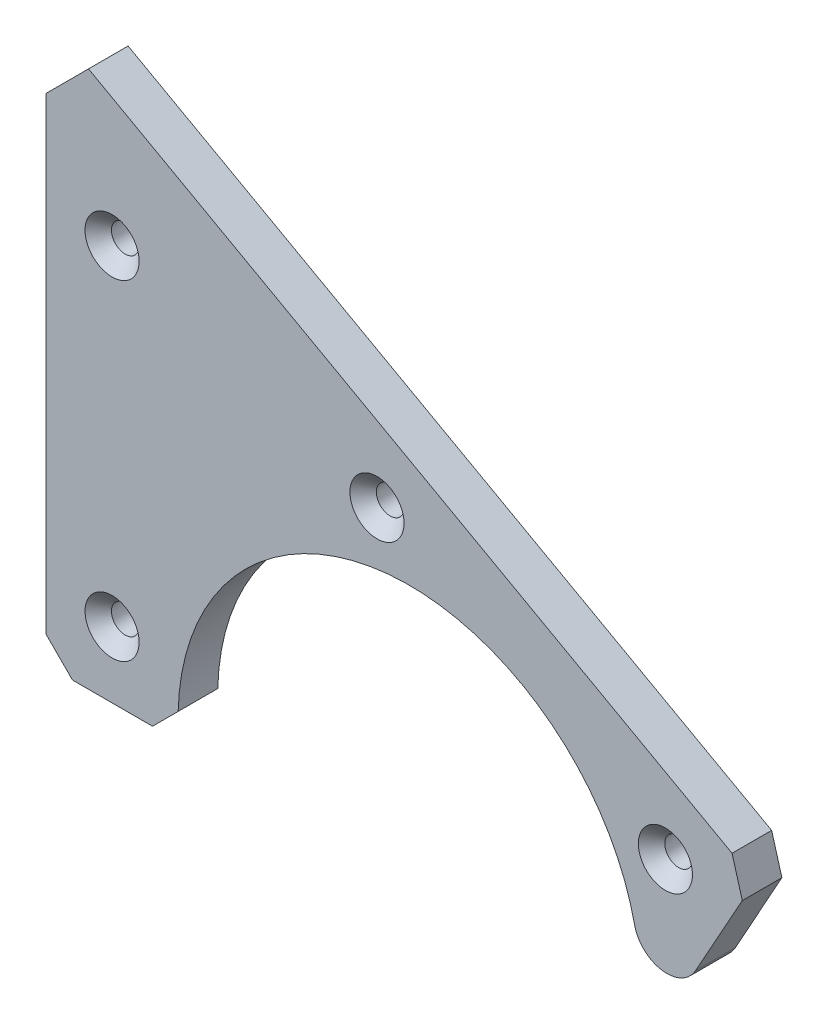
ISO-10303-21;
HEADER;
FILE_DESCRIPTION(('STEP AP214'),'2;1');
FILE_NAME('part.step','',(''),(''),'','','');
FILE_SCHEMA(('AUTOMOTIVE_DESIGN { 1 0 10303 214 1 1 1 1 }'));
ENDSEC;
DATA;
#1=APPLICATION_CONTEXT('core data for automotive mechanical design processes');
#2=APPLICATION_PROTOCOL_DEFINITION('international standard','automotive_design',2000,#1);
#3=PRODUCT_CONTEXT('',#1,'mechanical');
#4=PRODUCT('Part','Part','',(#3));
#5=PRODUCT_RELATED_PRODUCT_CATEGORY('part','',(#4));
#6=PRODUCT_DEFINITION_FORMATION('','',#4);
#7=PRODUCT_DEFINITION_CONTEXT('part definition',#1,'design');
#8=PRODUCT_DEFINITION('design','',#6,#7);
#9=PRODUCT_DEFINITION_SHAPE('','',#8);
#10=(LENGTH_UNIT() NAMED_UNIT(*) SI_UNIT(.MILLI.,.METRE.));
#11=(NAMED_UNIT(*) PLANE_ANGLE_UNIT() SI_UNIT($,.RADIAN.));
#12=(NAMED_UNIT(*) SI_UNIT($,.STERADIAN.) SOLID_ANGLE_UNIT());
#13=UNCERTAINTY_MEASURE_WITH_UNIT(LENGTH_MEASURE(1.E-05),#10,'distance_accuracy_value','');
#14=(GEOMETRIC_REPRESENTATION_CONTEXT(3) GLOBAL_UNCERTAINTY_ASSIGNED_CONTEXT((#13)) GLOBAL_UNIT_ASSIGNED_CONTEXT((#10,
#11,#12)) REPRESENTATION_CONTEXT('',''));
#15=CARTESIAN_POINT('',(0.,0.,0.));
#16=DIRECTION('',(0.,0.,1.));
#17=DIRECTION('',(1.,0.,0.));
#18=AXIS2_PLACEMENT_3D('',#15,#16,#17);
#19=CARTESIAN_POINT('',(0.,0.,3.));
#20=DIRECTION('',(0.,0.,1.));
#21=DIRECTION('',(1.,0.,0.));
#22=AXIS2_PLACEMENT_3D('',#19,#20,#21);
#23=PLANE('',#22);
#24=DIRECTION('',(1.,0.,0.));
#25=VECTOR('',#24,1.);
#26=CARTESIAN_POINT('',(-55.,-2.96629373950943,3.));
#27=LINE('',#26,#25);
#28=CARTESIAN_POINT('',(-51.,-2.96629373950943,3.));
#29=VERTEX_POINT('',#28);
#30=CARTESIAN_POINT('',(-38.8740749189272,-2.96629373950943,3.));
#31=VERTEX_POINT('',#30);
#32=EDGE_CURVE('E235',#29,#31,#27,.T.);
#33=ORIENTED_EDGE('',*,*,#32,.T.);
#34=DIRECTION('',(0.707106781186549,0.707106781186546,0.));
#35=VECTOR('',#34,1.);
#36=CARTESIAN_POINT('',(-17.9538905897088,17.9538905897089,3.));
#37=LINE('',#36,#35);
#38=CARTESIAN_POINT('',(-34.9879098656391,0.919871313778582,3.));
#39=VERTEX_POINT('',#38);
#40=EDGE_CURVE('E11',#31,#39,#37,.T.);
#41=ORIENTED_EDGE('',*,*,#40,.T.);
#42=CARTESIAN_POINT('',(0.,0.,3.));
#43=DIRECTION('',(0.,0.,1.));
#44=DIRECTION('',(1.,0.,0.));
#45=AXIS2_PLACEMENT_3D('',#42,#43,#44);
#46=CIRCLE('',#45,35.);
#47=CARTESIAN_POINT('',(34.1894196895976,7.48889720109401,3.));
#48=VERTEX_POINT('',#47);
#49=EDGE_CURVE('E219',#48,#39,#46,.T.);
#50=ORIENTED_EDGE('',*,*,#49,.F.);
#51=CARTESIAN_POINT('',(39.0736225023973,8.55873965839316,3.));
#52=DIRECTION('',(0.,0.,1.));
#53=DIRECTION('',(1.,0.,0.));
#54=AXIS2_PLACEMENT_3D('',#51,#52,#53);
#55=CIRCLE('',#54,5.);
#56=CARTESIAN_POINT('',(43.444408883005,6.13052500250001,3.));
#57=VERTEX_POINT('',#56);
#58=EDGE_CURVE('E206',#48,#57,#55,.T.);
#59=ORIENTED_EDGE('',*,*,#58,.T.);
#60=DIRECTION('',(0.485642931178632,0.874157276121538,0.));
#61=VECTOR('',#60,1.);
#62=CARTESIAN_POINT('',(30.5955046642538,-16.9975025912521,3.));
#63=LINE('',#62,#61);
#64=CARTESIAN_POINT('',(50.5068648425777,18.842945729731,3.));
#65=VERTEX_POINT('',#64);
#66=EDGE_CURVE('E135',#57,#65,#63,.T.);
#67=ORIENTED_EDGE('',*,*,#66,.T.);
#68=DIRECTION('',(0.27472112789738,-0.961523947640823,0.));
#69=VECTOR('',#68,1.);
#70=CARTESIAN_POINT('',(51.6724078774065,14.7635451078305,3.));
#71=LINE('',#70,#69);
#72=CARTESIAN_POINT('',(48.9528074628061,24.2821465589316,3.));
#73=VERTEX_POINT('',#72);
#74=EDGE_CURVE('E159',#65,#73,#71,.F.);
#75=ORIENTED_EDGE('',*,*,#74,.T.);
#76=DIRECTION('',(-0.874157276121538,0.485642931178632,0.));
#77=VECTOR('',#76,1.);
#78=CARTESIAN_POINT('',(52.4494365672923,22.3395748342171,3.));
#79=LINE('',#78,#77);
#80=CARTESIAN_POINT('',(-48.5714285714286,78.462277689062,3.));
#81=VERTEX_POINT('',#80);
#82=EDGE_CURVE('E134',#73,#81,#79,.T.);
#83=ORIENTED_EDGE('',*,*,#82,.T.);
#84=DIRECTION('',(0.707106781186546,0.707106781186549,0.));
#85=VECTOR('',#84,1.);
#86=CARTESIAN_POINT('',(-63.5168531302454,63.5168531302451,3.));
#87=LINE('',#86,#85);
#88=CARTESIAN_POINT('',(-55.,72.0337062604905,3.));
#89=VERTEX_POINT('',#88);
#90=EDGE_CURVE('E173',#81,#89,#87,.F.);
#91=ORIENTED_EDGE('',*,*,#90,.T.);
#92=DIRECTION('',(0.,-1.,0.));
#93=VECTOR('',#92,1.);
#94=CARTESIAN_POINT('',(-55.,82.0337062604906,3.));
#95=LINE('',#94,#93);
#96=CARTESIAN_POINT('',(-55.,1.03370626049055,3.));
#97=VERTEX_POINT('',#96);
#98=EDGE_CURVE('E234',#89,#97,#95,.T.);
#99=ORIENTED_EDGE('',*,*,#98,.T.);
#100=DIRECTION('',(-0.707106781186546,0.707106781186549,0.));
#101=VECTOR('',#100,1.);
#102=CARTESIAN_POINT('',(-26.9831468697548,-26.9831468697547,3.));
#103=LINE('',#102,#101);
#104=EDGE_CURVE('E157',#97,#29,#103,.F.);
#105=ORIENTED_EDGE('',*,*,#104,.T.);
#106=EDGE_LOOP('',(#33,#41,#50,#59,#67,#75,#83,#91,#99,#105));
#107=FACE_BOUND('',#106,.T.);
#108=CARTESIAN_POINT('',(38.8514344942906,18.454431384788,3.));
#109=DIRECTION('',(0.,0.,1.));
#110=DIRECTION('',(1.,0.,0.));
#111=AXIS2_PLACEMENT_3D('',#108,#109,#110);
#112=CIRCLE('',#111,4.10000000000002);
#113=CARTESIAN_POINT('',(42.9514344942906,18.454431384788,3.));
#114=VERTEX_POINT('',#113);
#115=EDGE_CURVE('E184',#114,#114,#112,.F.);
#116=ORIENTED_EDGE('',*,*,#115,.T.);
#117=EDGE_LOOP('',(#116));
#118=FACE_BOUND('',#117,.T.);
#119=CARTESIAN_POINT('',(-4.85642931178634,42.7365779437196,3.));
#120=DIRECTION('',(0.,0.,1.));
#121=DIRECTION('',(1.,0.,0.));
#122=AXIS2_PLACEMENT_3D('',#119,#120,#121);
#123=CIRCLE('',#122,4.09999999999998);
#124=CARTESIAN_POINT('',(-0.756429311786358,42.7365779437196,3.));
#125=VERTEX_POINT('',#124);
#126=EDGE_CURVE('E181',#125,#125,#123,.F.);
#127=ORIENTED_EDGE('',*,*,#126,.T.);
#128=EDGE_LOOP('',(#127));
#129=FACE_BOUND('',#128,.T.);
#130=CARTESIAN_POINT('',(-45.,7.03370626049057,3.));
#131=DIRECTION('',(0.,0.,1.));
#132=DIRECTION('',(1.,0.,0.));
#133=AXIS2_PLACEMENT_3D('',#130,#131,#132);
#134=CIRCLE('',#133,4.09999999999998);
#135=CARTESIAN_POINT('',(-40.9,7.03370626049057,3.));
#136=VERTEX_POINT('',#135);
#137=EDGE_CURVE('E178',#136,#136,#134,.F.);
#138=ORIENTED_EDGE('',*,*,#137,.T.);
#139=EDGE_LOOP('',(#138));
#140=FACE_BOUND('',#139,.T.);
#141=CARTESIAN_POINT('',(-45.,57.0337062604906,3.));
#142=DIRECTION('',(0.,0.,1.));
#143=DIRECTION('',(1.,0.,0.));
#144=AXIS2_PLACEMENT_3D('',#141,#142,#143);
#145=CIRCLE('',#144,4.09999999999998);
#146=CARTESIAN_POINT('',(-40.9,57.0337062604906,3.));
#147=VERTEX_POINT('',#146);
#148=EDGE_CURVE('E175',#147,#147,#145,.F.);
#149=ORIENTED_EDGE('',*,*,#148,.T.);
#150=EDGE_LOOP('',(#149));
#151=FACE_BOUND('',#150,.T.);
#152=ADVANCED_FACE('F37',(#107,#118,#129,#140,#151),#23,.T.);
#153=CARTESIAN_POINT('',(0.,0.,-3.));
#154=DIRECTION('',(0.,0.,1.));
#155=DIRECTION('',(1.,0.,0.));
#156=AXIS2_PLACEMENT_3D('',#153,#154,#155);
#157=PLANE('',#156);
#158=CARTESIAN_POINT('',(-4.85642931178634,42.7365779437196,-3.));
#159=DIRECTION('',(0.,0.,1.));
#160=DIRECTION('',(1.,0.,0.));
#161=AXIS2_PLACEMENT_3D('',#158,#159,#160);
#162=CIRCLE('',#161,2.1);
#163=CARTESIAN_POINT('',(-2.75642931178634,42.7365779437196,-3.));
#164=VERTEX_POINT('',#163);
#165=EDGE_CURVE('E225',#164,#164,#162,.T.);
#166=ORIENTED_EDGE('',*,*,#165,.T.);
#167=EDGE_LOOP('',(#166));
#168=FACE_BOUND('',#167,.T.);
#169=CARTESIAN_POINT('',(38.8514344942906,18.454431384788,-3.));
#170=DIRECTION('',(0.,0.,1.));
#171=DIRECTION('',(1.,0.,0.));
#172=AXIS2_PLACEMENT_3D('',#169,#170,#171);
#173=CIRCLE('',#172,2.1);
#174=CARTESIAN_POINT('',(40.9514344942906,18.454431384788,-3.));
#175=VERTEX_POINT('',#174);
#176=EDGE_CURVE('E222',#175,#175,#173,.T.);
#177=ORIENTED_EDGE('',*,*,#176,.T.);
#178=EDGE_LOOP('',(#177));
#179=FACE_BOUND('',#178,.T.);
#180=CARTESIAN_POINT('',(-45.,7.03370626049057,-3.));
#181=DIRECTION('',(0.,0.,1.));
#182=DIRECTION('',(1.,0.,0.));
#183=AXIS2_PLACEMENT_3D('',#180,#181,#182);
#184=CIRCLE('',#183,2.1);
#185=CARTESIAN_POINT('',(-42.9,7.03370626049057,-3.));
#186=VERTEX_POINT('',#185);
#187=EDGE_CURVE('E141',#186,#186,#184,.T.);
#188=ORIENTED_EDGE('',*,*,#187,.T.);
#189=EDGE_LOOP('',(#188));
#190=FACE_BOUND('',#189,.T.);
#191=CARTESIAN_POINT('',(-45.,57.0337062604906,-3.));
#192=DIRECTION('',(0.,0.,1.));
#193=DIRECTION('',(1.,0.,0.));
#194=AXIS2_PLACEMENT_3D('',#191,#192,#193);
#195=CIRCLE('',#194,2.1);
#196=CARTESIAN_POINT('',(-42.9,57.0337062604906,-3.));
#197=VERTEX_POINT('',#196);
#198=EDGE_CURVE('E146',#197,#197,#195,.T.);
#199=ORIENTED_EDGE('',*,*,#198,.T.);
#200=EDGE_LOOP('',(#199));
#201=FACE_BOUND('',#200,.T.);
#202=CARTESIAN_POINT('',(0.,0.,-3.));
#203=DIRECTION('',(0.,0.,1.));
#204=DIRECTION('',(1.,0.,0.));
#205=AXIS2_PLACEMENT_3D('',#202,#203,#204);
#206=CIRCLE('',#205,35.);
#207=CARTESIAN_POINT('',(34.1894196895976,7.48889720109401,-3.));
#208=VERTEX_POINT('',#207);
#209=CARTESIAN_POINT('',(-34.9879098656391,0.919871313778582,-3.));
#210=VERTEX_POINT('',#209);
#211=EDGE_CURVE('E216',#208,#210,#206,.T.);
#212=ORIENTED_EDGE('',*,*,#211,.T.);
#213=DIRECTION('',(-0.707106781186549,-0.707106781186546,0.));
#214=VECTOR('',#213,1.);
#215=CARTESIAN_POINT('',(-34.9879098656391,0.919871313778582,-3.));
#216=LINE('',#215,#214);
#217=CARTESIAN_POINT('',(-38.8740749189272,-2.96629373950943,-3.));
#218=VERTEX_POINT('',#217);
#219=EDGE_CURVE('E60',#210,#218,#216,.T.);
#220=ORIENTED_EDGE('',*,*,#219,.T.);
#221=DIRECTION('',(1.,0.,0.));
#222=VECTOR('',#221,1.);
#223=CARTESIAN_POINT('',(-55.,-2.96629373950943,-3.));
#224=LINE('',#223,#222);
#225=CARTESIAN_POINT('',(-51.,-2.96629373950943,-3.));
#226=VERTEX_POINT('',#225);
#227=EDGE_CURVE('E143',#226,#218,#224,.T.);
#228=ORIENTED_EDGE('',*,*,#227,.F.);
#229=DIRECTION('',(0.707106781186546,-0.707106781186549,0.));
#230=VECTOR('',#229,1.);
#231=CARTESIAN_POINT('',(-51.,-2.96629373950943,-3.));
#232=LINE('',#231,#230);
#233=CARTESIAN_POINT('',(-55.,1.03370626049055,-3.));
#234=VERTEX_POINT('',#233);
#235=EDGE_CURVE('E125',#226,#234,#232,.F.);
#236=ORIENTED_EDGE('',*,*,#235,.T.);
#237=DIRECTION('',(0.,-1.,0.));
#238=VECTOR('',#237,1.);
#239=CARTESIAN_POINT('',(-55.,82.0337062604906,-3.));
#240=LINE('',#239,#238);
#241=CARTESIAN_POINT('',(-55.,72.0337062604905,-3.));
#242=VERTEX_POINT('',#241);
#243=EDGE_CURVE('E140',#242,#234,#240,.T.);
#244=ORIENTED_EDGE('',*,*,#243,.F.);
#245=DIRECTION('',(-0.707106781186546,-0.707106781186549,0.));
#246=VECTOR('',#245,1.);
#247=CARTESIAN_POINT('',(-55.,72.0337062604905,-3.));
#248=LINE('',#247,#246);
#249=CARTESIAN_POINT('',(-48.5714285714286,78.462277689062,-3.));
#250=VERTEX_POINT('',#249);
#251=EDGE_CURVE('E139',#242,#250,#248,.F.);
#252=ORIENTED_EDGE('',*,*,#251,.T.);
#253=DIRECTION('',(-0.874157276121538,0.485642931178632,0.));
#254=VECTOR('',#253,1.);
#255=CARTESIAN_POINT('',(52.4494365672923,22.3395748342171,-3.));
#256=LINE('',#255,#254);
#257=CARTESIAN_POINT('',(48.9528074628061,24.2821465589316,-3.));
#258=VERTEX_POINT('',#257);
#259=EDGE_CURVE('E131',#258,#250,#256,.T.);
#260=ORIENTED_EDGE('',*,*,#259,.F.);
#261=DIRECTION('',(-0.27472112789738,0.961523947640823,0.));
#262=VECTOR('',#261,1.);
#263=CARTESIAN_POINT('',(48.9528074628061,24.2821465589316,-3.));
#264=LINE('',#263,#262);
#265=CARTESIAN_POINT('',(50.5068648425777,18.842945729731,-3.));
#266=VERTEX_POINT('',#265);
#267=EDGE_CURVE('E116',#258,#266,#264,.F.);
#268=ORIENTED_EDGE('',*,*,#267,.T.);
#269=DIRECTION('',(0.485642931178632,0.874157276121538,0.));
#270=VECTOR('',#269,1.);
#271=CARTESIAN_POINT('',(30.5955046642538,-16.9975025912521,-3.));
#272=LINE('',#271,#270);
#273=CARTESIAN_POINT('',(43.444408883005,6.13052500250001,-3.));
#274=VERTEX_POINT('',#273);
#275=EDGE_CURVE('E152',#274,#266,#272,.T.);
#276=ORIENTED_EDGE('',*,*,#275,.F.);
#277=CARTESIAN_POINT('',(39.0736225023973,8.55873965839316,-3.));
#278=DIRECTION('',(0.,0.,1.));
#279=DIRECTION('',(1.,0.,0.));
#280=AXIS2_PLACEMENT_3D('',#277,#278,#279);
#281=CIRCLE('',#280,5.);
#282=EDGE_CURVE('E202',#274,#208,#281,.F.);
#283=ORIENTED_EDGE('',*,*,#282,.T.);
#284=EDGE_LOOP('',(#212,#220,#228,#236,#244,#252,#260,#268,#276,#283));
#285=FACE_BOUND('',#284,.T.);
#286=ADVANCED_FACE('F137',(#168,#179,#190,#201,#285),#157,.F.);
#287=CARTESIAN_POINT('',(52.4494365672923,22.3395748342171,3.));
#288=DIRECTION('',(-0.485642931178632,-0.874157276121538,0.));
#289=DIRECTION('',(0.874157276121538,-0.485642931178632,0.));
#290=AXIS2_PLACEMENT_3D('',#287,#288,#289);
#291=PLANE('',#290);
#292=ORIENTED_EDGE('',*,*,#259,.T.);
#293=DIRECTION('',(0.,0.,1.));
#294=VECTOR('',#293,1.);
#295=CARTESIAN_POINT('',(-48.5714285714285,78.462277689062,3.));
#296=LINE('',#295,#294);
#297=EDGE_CURVE('E171',#250,#81,#296,.T.);
#298=ORIENTED_EDGE('',*,*,#297,.T.);
#299=ORIENTED_EDGE('',*,*,#82,.F.);
#300=DIRECTION('',(0.,0.,-1.));
#301=VECTOR('',#300,1.);
#302=CARTESIAN_POINT('',(48.9528074628061,24.2821465589316,3.));
#303=LINE('',#302,#301);
#304=EDGE_CURVE('E120',#73,#258,#303,.T.);
#305=ORIENTED_EDGE('',*,*,#304,.T.);
#306=EDGE_LOOP('',(#292,#298,#299,#305));
#307=FACE_BOUND('',#306,.T.);
#308=ADVANCED_FACE('F130',(#307),#291,.F.);
#309=CARTESIAN_POINT('',(-55.,82.0337062604906,3.));
#310=DIRECTION('',(1.,0.,0.));
#311=DIRECTION('',(0.,1.,0.));
#312=AXIS2_PLACEMENT_3D('',#309,#310,#311);
#313=PLANE('',#312);
#314=ORIENTED_EDGE('',*,*,#98,.F.);
#315=DIRECTION('',(0.,0.,-1.));
#316=VECTOR('',#315,1.);
#317=CARTESIAN_POINT('',(-55.,72.0337062604905,3.));
#318=LINE('',#317,#316);
#319=EDGE_CURVE('E167',#89,#242,#318,.T.);
#320=ORIENTED_EDGE('',*,*,#319,.T.);
#321=ORIENTED_EDGE('',*,*,#243,.T.);
#322=DIRECTION('',(0.,0.,1.));
#323=VECTOR('',#322,1.);
#324=CARTESIAN_POINT('',(-55.,1.03370626049055,3.));
#325=LINE('',#324,#323);
#326=EDGE_CURVE('E164',#234,#97,#325,.T.);
#327=ORIENTED_EDGE('',*,*,#326,.T.);
#328=EDGE_LOOP('',(#314,#320,#321,#327));
#329=FACE_BOUND('',#328,.T.);
#330=ADVANCED_FACE('F265',(#329),#313,.F.);
#331=CARTESIAN_POINT('',(-55.,-2.96629373950943,3.));
#332=DIRECTION('',(0.,1.,0.));
#333=DIRECTION('',(-1.,0.,0.));
#334=AXIS2_PLACEMENT_3D('',#331,#332,#333);
#335=PLANE('',#334);
#336=ORIENTED_EDGE('',*,*,#227,.T.);
#337=DIRECTION('',(0.,0.,1.));
#338=VECTOR('',#337,1.);
#339=CARTESIAN_POINT('',(-38.8740749189272,-2.96629373950943,3.));
#340=LINE('',#339,#338);
#341=EDGE_CURVE('E46',#218,#31,#340,.T.);
#342=ORIENTED_EDGE('',*,*,#341,.T.);
#343=ORIENTED_EDGE('',*,*,#32,.F.);
#344=DIRECTION('',(0.,0.,-1.));
#345=VECTOR('',#344,1.);
#346=CARTESIAN_POINT('',(-51.,-2.96629373950943,3.));
#347=LINE('',#346,#345);
#348=EDGE_CURVE('E161',#29,#226,#347,.T.);
#349=ORIENTED_EDGE('',*,*,#348,.T.);
#350=EDGE_LOOP('',(#336,#342,#343,#349));
#351=FACE_BOUND('',#350,.T.);
#352=ADVANCED_FACE('F262',(#351),#335,.F.);
#353=CARTESIAN_POINT('',(30.5955046642538,-16.9975025912521,3.));
#354=DIRECTION('',(-0.874157276121538,0.485642931178632,0.));
#355=DIRECTION('',(-0.485642931178632,-0.874157276121538,0.));
#356=AXIS2_PLACEMENT_3D('',#353,#354,#355);
#357=PLANE('',#356);
#358=ORIENTED_EDGE('',*,*,#66,.F.);
#359=DIRECTION('',(0.,0.,1.));
#360=VECTOR('',#359,1.);
#361=CARTESIAN_POINT('',(43.444408883005,6.13052500250001,3.));
#362=LINE('',#361,#360);
#363=EDGE_CURVE('E199',#57,#274,#362,.F.);
#364=ORIENTED_EDGE('',*,*,#363,.T.);
#365=ORIENTED_EDGE('',*,*,#275,.T.);
#366=DIRECTION('',(0.,0.,1.));
#367=VECTOR('',#366,1.);
#368=CARTESIAN_POINT('',(50.5068648425778,18.842945729731,3.));
#369=LINE('',#368,#367);
#370=EDGE_CURVE('E122',#266,#65,#369,.T.);
#371=ORIENTED_EDGE('',*,*,#370,.T.);
#372=EDGE_LOOP('',(#358,#364,#365,#371));
#373=FACE_BOUND('',#372,.T.);
#374=ADVANCED_FACE('F242',(#373),#357,.F.);
#375=CARTESIAN_POINT('',(-45.,57.0337062604906,-3.));
#376=DIRECTION('',(0.,0.,1.));
#377=DIRECTION('',(1.,0.,0.));
#378=AXIS2_PLACEMENT_3D('',#375,#376,#377);
#379=CYLINDRICAL_SURFACE('',#378,2.1);
#380=CARTESIAN_POINT('',(-45.,57.0337062604906,1.00000000000002));
#381=DIRECTION('',(0.,0.,1.));
#382=DIRECTION('',(1.,0.,0.));
#383=AXIS2_PLACEMENT_3D('',#380,#381,#382);
#384=CIRCLE('',#383,2.1);
#385=CARTESIAN_POINT('',(-42.9,57.0337062604906,1.00000000000002));
#386=VERTEX_POINT('',#385);
#387=EDGE_CURVE('E196',#386,#386,#384,.T.);
#388=ORIENTED_EDGE('',*,*,#387,.T.);
#389=EDGE_LOOP('',(#388));
#390=FACE_BOUND('',#389,.T.);
#391=ORIENTED_EDGE('',*,*,#198,.F.);
#392=EDGE_LOOP('',(#391));
#393=FACE_BOUND('',#392,.T.);
#394=ADVANCED_FACE('F257',(#390,#393),#379,.F.);
#395=CARTESIAN_POINT('',(-45.,7.03370626049057,-3.));
#396=DIRECTION('',(0.,0.,1.));
#397=DIRECTION('',(1.,0.,0.));
#398=AXIS2_PLACEMENT_3D('',#395,#396,#397);
#399=CYLINDRICAL_SURFACE('',#398,2.1);
#400=CARTESIAN_POINT('',(-45.,7.03370626049057,1.00000000000002));
#401=DIRECTION('',(0.,0.,1.));
#402=DIRECTION('',(1.,0.,0.));
#403=AXIS2_PLACEMENT_3D('',#400,#401,#402);
#404=CIRCLE('',#403,2.1);
#405=CARTESIAN_POINT('',(-42.9,7.03370626049057,1.00000000000002));
#406=VERTEX_POINT('',#405);
#407=EDGE_CURVE('E193',#406,#406,#404,.T.);
#408=ORIENTED_EDGE('',*,*,#407,.T.);
#409=EDGE_LOOP('',(#408));
#410=FACE_BOUND('',#409,.T.);
#411=ORIENTED_EDGE('',*,*,#187,.F.);
#412=EDGE_LOOP('',(#411));
#413=FACE_BOUND('',#412,.T.);
#414=ADVANCED_FACE('F278',(#410,#413),#399,.F.);
#415=CARTESIAN_POINT('',(48.9528074628061,24.2821465589316,3.));
#416=DIRECTION('',(-0.961523947640822,-0.27472112789738,0.));
#417=DIRECTION('',(0.,0.,-1.));
#418=AXIS2_PLACEMENT_3D('',#415,#416,#417);
#419=PLANE('',#418);
#420=ORIENTED_EDGE('',*,*,#74,.F.);
#421=ORIENTED_EDGE('',*,*,#370,.F.);
#422=ORIENTED_EDGE('',*,*,#267,.F.);
#423=ORIENTED_EDGE('',*,*,#304,.F.);
#424=EDGE_LOOP('',(#420,#421,#422,#423));
#425=FACE_BOUND('',#424,.T.);
#426=ADVANCED_FACE('F119',(#425),#419,.F.);
#427=CARTESIAN_POINT('',(-51.,-2.96629373950943,3.));
#428=DIRECTION('',(0.707106781186549,0.707106781186546,0.));
#429=DIRECTION('',(0.,0.,-1.));
#430=AXIS2_PLACEMENT_3D('',#427,#428,#429);
#431=PLANE('',#430);
#432=ORIENTED_EDGE('',*,*,#104,.F.);
#433=ORIENTED_EDGE('',*,*,#326,.F.);
#434=ORIENTED_EDGE('',*,*,#235,.F.);
#435=ORIENTED_EDGE('',*,*,#348,.F.);
#436=EDGE_LOOP('',(#432,#433,#434,#435));
#437=FACE_BOUND('',#436,.T.);
#438=ADVANCED_FACE('F277',(#437),#431,.F.);
#439=CARTESIAN_POINT('',(-55.,72.0337062604905,3.));
#440=DIRECTION('',(0.707106781186549,-0.707106781186546,0.));
#441=DIRECTION('',(0.,0.,-1.));
#442=AXIS2_PLACEMENT_3D('',#439,#440,#441);
#443=PLANE('',#442);
#444=ORIENTED_EDGE('',*,*,#90,.F.);
#445=ORIENTED_EDGE('',*,*,#297,.F.);
#446=ORIENTED_EDGE('',*,*,#251,.F.);
#447=ORIENTED_EDGE('',*,*,#319,.F.);
#448=EDGE_LOOP('',(#444,#445,#446,#447));
#449=FACE_BOUND('',#448,.T.);
#450=ADVANCED_FACE('F284',(#449),#443,.F.);
#451=CARTESIAN_POINT('',(38.8514344942906,18.454431384788,-3.));
#452=DIRECTION('',(0.,0.,1.));
#453=DIRECTION('',(1.,0.,0.));
#454=AXIS2_PLACEMENT_3D('',#451,#452,#453);
#455=CYLINDRICAL_SURFACE('',#454,2.1);
#456=CARTESIAN_POINT('',(38.8514344942906,18.454431384788,0.999999999999998));
#457=DIRECTION('',(0.,0.,1.));
#458=DIRECTION('',(1.,0.,0.));
#459=AXIS2_PLACEMENT_3D('',#456,#457,#458);
#460=CIRCLE('',#459,2.1);
#461=CARTESIAN_POINT('',(40.9514344942906,18.454431384788,0.999999999999998));
#462=VERTEX_POINT('',#461);
#463=EDGE_CURVE('E187',#462,#462,#460,.T.);
#464=ORIENTED_EDGE('',*,*,#463,.T.);
#465=EDGE_LOOP('',(#464));
#466=FACE_BOUND('',#465,.T.);
#467=ORIENTED_EDGE('',*,*,#176,.F.);
#468=EDGE_LOOP('',(#467));
#469=FACE_BOUND('',#468,.T.);
#470=ADVANCED_FACE('F291',(#466,#469),#455,.F.);
#471=CARTESIAN_POINT('',(-4.85642931178634,42.7365779437196,-3.));
#472=DIRECTION('',(0.,0.,1.));
#473=DIRECTION('',(1.,0.,0.));
#474=AXIS2_PLACEMENT_3D('',#471,#472,#473);
#475=CYLINDRICAL_SURFACE('',#474,2.1);
#476=CARTESIAN_POINT('',(-4.85642931178634,42.7365779437196,1.00000000000003));
#477=DIRECTION('',(0.,0.,1.));
#478=DIRECTION('',(1.,0.,0.));
#479=AXIS2_PLACEMENT_3D('',#476,#477,#478);
#480=CIRCLE('',#479,2.1);
#481=CARTESIAN_POINT('',(-2.75642931178634,42.7365779437196,1.00000000000003));
#482=VERTEX_POINT('',#481);
#483=EDGE_CURVE('E190',#482,#482,#480,.T.);
#484=ORIENTED_EDGE('',*,*,#483,.T.);
#485=EDGE_LOOP('',(#484));
#486=FACE_BOUND('',#485,.T.);
#487=ORIENTED_EDGE('',*,*,#165,.F.);
#488=EDGE_LOOP('',(#487));
#489=FACE_BOUND('',#488,.T.);
#490=ADVANCED_FACE('F300',(#486,#489),#475,.F.);
#491=CARTESIAN_POINT('',(38.8514344942906,18.454431384788,0.999999999999998));
#492=DIRECTION('',(0.,0.,1.));
#493=DIRECTION('',(1.,0.,0.));
#494=AXIS2_PLACEMENT_3D('',#491,#492,#493);
#495=CONICAL_SURFACE('',#494,2.1,0.785398163397454);
#496=ORIENTED_EDGE('',*,*,#115,.F.);
#497=EDGE_LOOP('',(#496));
#498=FACE_BOUND('',#497,.T.);
#499=ORIENTED_EDGE('',*,*,#463,.F.);
#500=EDGE_LOOP('',(#499));
#501=FACE_BOUND('',#500,.T.);
#502=ADVANCED_FACE('F293',(#498,#501),#495,.F.);
#503=CARTESIAN_POINT('',(-4.85642931178634,42.7365779437196,1.00000000000003));
#504=DIRECTION('',(0.,0.,1.));
#505=DIRECTION('',(1.,0.,0.));
#506=AXIS2_PLACEMENT_3D('',#503,#504,#505);
#507=CONICAL_SURFACE('',#506,2.1,0.78539816339745);
#508=ORIENTED_EDGE('',*,*,#126,.F.);
#509=EDGE_LOOP('',(#508));
#510=FACE_BOUND('',#509,.T.);
#511=ORIENTED_EDGE('',*,*,#483,.F.);
#512=EDGE_LOOP('',(#511));
#513=FACE_BOUND('',#512,.T.);
#514=ADVANCED_FACE('F299',(#510,#513),#507,.F.);
#515=CARTESIAN_POINT('',(-45.,7.03370626049057,1.00000000000002));
#516=DIRECTION('',(0.,0.,1.));
#517=DIRECTION('',(1.,0.,0.));
#518=AXIS2_PLACEMENT_3D('',#515,#516,#517);
#519=CONICAL_SURFACE('',#518,2.1,0.78539816339745);
#520=ORIENTED_EDGE('',*,*,#137,.F.);
#521=EDGE_LOOP('',(#520));
#522=FACE_BOUND('',#521,.T.);
#523=ORIENTED_EDGE('',*,*,#407,.F.);
#524=EDGE_LOOP('',(#523));
#525=FACE_BOUND('',#524,.T.);
#526=ADVANCED_FACE('F307',(#522,#525),#519,.F.);
#527=CARTESIAN_POINT('',(-45.,57.0337062604906,1.00000000000002));
#528=DIRECTION('',(0.,0.,1.));
#529=DIRECTION('',(1.,0.,0.));
#530=AXIS2_PLACEMENT_3D('',#527,#528,#529);
#531=CONICAL_SURFACE('',#530,2.1,0.78539816339745);
#532=ORIENTED_EDGE('',*,*,#148,.F.);
#533=EDGE_LOOP('',(#532));
#534=FACE_BOUND('',#533,.T.);
#535=ORIENTED_EDGE('',*,*,#387,.F.);
#536=EDGE_LOOP('',(#535));
#537=FACE_BOUND('',#536,.T.);
#538=ADVANCED_FACE('F314',(#534,#537),#531,.F.);
#539=CARTESIAN_POINT('',(0.,0.,-3.));
#540=DIRECTION('',(0.,0.,1.));
#541=DIRECTION('',(1.,0.,0.));
#542=AXIS2_PLACEMENT_3D('',#539,#540,#541);
#543=CYLINDRICAL_SURFACE('',#542,35.);
#544=ORIENTED_EDGE('',*,*,#49,.T.);
#545=DIRECTION('',(0.,0.,1.));
#546=VECTOR('',#545,1.);
#547=CARTESIAN_POINT('',(-34.9879098656391,0.919871313778582,-3.));
#548=LINE('',#547,#546);
#549=EDGE_CURVE('E208',#39,#210,#548,.F.);
#550=ORIENTED_EDGE('',*,*,#549,.T.);
#551=ORIENTED_EDGE('',*,*,#211,.F.);
#552=DIRECTION('',(0.,0.,1.));
#553=VECTOR('',#552,1.);
#554=CARTESIAN_POINT('',(34.1894196895976,7.48889720109401,-3.));
#555=LINE('',#554,#553);
#556=EDGE_CURVE('E204',#208,#48,#555,.T.);
#557=ORIENTED_EDGE('',*,*,#556,.T.);
#558=EDGE_LOOP('',(#544,#550,#551,#557));
#559=FACE_BOUND('',#558,.T.);
#560=ADVANCED_FACE('F215',(#559),#543,.F.);
#561=CARTESIAN_POINT('',(39.0736225023973,8.55873965839316,-3.));
#562=DIRECTION('',(0.,0.,1.));
#563=DIRECTION('',(1.,0.,0.));
#564=AXIS2_PLACEMENT_3D('',#561,#562,#563);
#565=CYLINDRICAL_SURFACE('',#564,5.);
#566=ORIENTED_EDGE('',*,*,#58,.F.);
#567=ORIENTED_EDGE('',*,*,#556,.F.);
#568=ORIENTED_EDGE('',*,*,#282,.F.);
#569=ORIENTED_EDGE('',*,*,#363,.F.);
#570=EDGE_LOOP('',(#566,#567,#568,#569));
#571=FACE_BOUND('',#570,.T.);
#572=ADVANCED_FACE('F244',(#571),#565,.T.);
#573=CARTESIAN_POINT('',(-34.9879098656391,0.919871313778582,-3.));
#574=DIRECTION('',(0.707106781186546,-0.707106781186549,0.));
#575=DIRECTION('',(0.,0.,1.));
#576=AXIS2_PLACEMENT_3D('',#573,#574,#575);
#577=PLANE('',#576);
#578=ORIENTED_EDGE('',*,*,#40,.F.);
#579=ORIENTED_EDGE('',*,*,#341,.F.);
#580=ORIENTED_EDGE('',*,*,#219,.F.);
#581=ORIENTED_EDGE('',*,*,#549,.F.);
#582=EDGE_LOOP('',(#578,#579,#580,#581));
#583=FACE_BOUND('',#582,.T.);
#584=ADVANCED_FACE('F40',(#583),#577,.T.);
#585=CLOSED_SHELL('',(#152,#286,#308,#330,#352,#374,#394,#414,#426,#438,#450,#470,#490,#502,
#514,#526,#538,#560,#572,#584));
#586=MANIFOLD_SOLID_BREP('B2',#585);
#587=ADVANCED_BREP_SHAPE_REPRESENTATION('',(#18,#586),#14);
#588=SHAPE_DEFINITION_REPRESENTATION(#9,#587);
ENDSEC;
END-ISO-10303-21;
